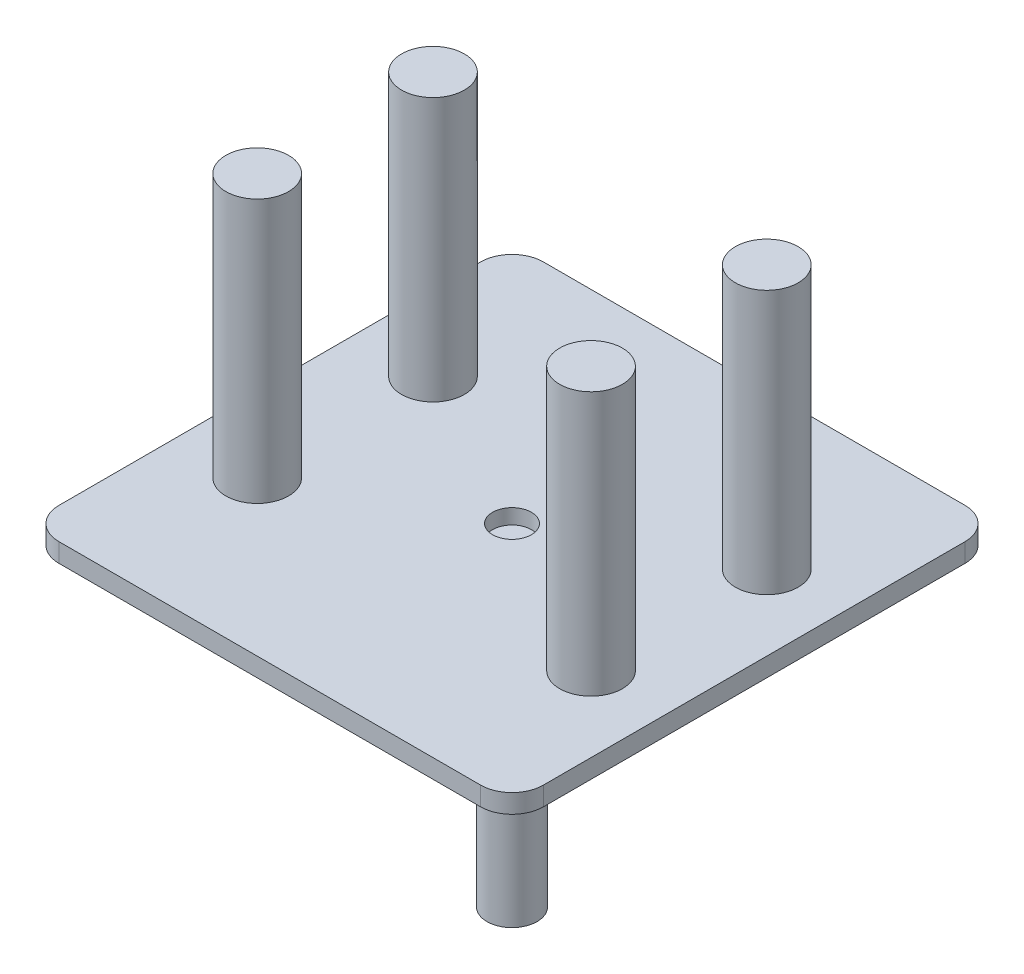
ISO-10303-21;
HEADER;
FILE_DESCRIPTION(('STEP AP214'),'2;1');
FILE_NAME('part.step','',(''),(''),'','','');
FILE_SCHEMA(('AUTOMOTIVE_DESIGN { 1 0 10303 214 1 1 1 1 }'));
ENDSEC;
DATA;
#1=APPLICATION_CONTEXT('core data for automotive mechanical design processes');
#2=APPLICATION_PROTOCOL_DEFINITION('international standard','automotive_design',2000,#1);
#3=PRODUCT_CONTEXT('',#1,'mechanical');
#4=PRODUCT('Part','Part','',(#3));
#5=PRODUCT_RELATED_PRODUCT_CATEGORY('part','',(#4));
#6=PRODUCT_DEFINITION_FORMATION('','',#4);
#7=PRODUCT_DEFINITION_CONTEXT('part definition',#1,'design');
#8=PRODUCT_DEFINITION('design','',#6,#7);
#9=PRODUCT_DEFINITION_SHAPE('','',#8);
#10=(LENGTH_UNIT() NAMED_UNIT(*) SI_UNIT(.MILLI.,.METRE.));
#11=(NAMED_UNIT(*) PLANE_ANGLE_UNIT() SI_UNIT($,.RADIAN.));
#12=(NAMED_UNIT(*) SI_UNIT($,.STERADIAN.) SOLID_ANGLE_UNIT());
#13=UNCERTAINTY_MEASURE_WITH_UNIT(LENGTH_MEASURE(1.E-05),#10,'distance_accuracy_value','');
#14=(GEOMETRIC_REPRESENTATION_CONTEXT(3) GLOBAL_UNCERTAINTY_ASSIGNED_CONTEXT((#13)) GLOBAL_UNIT_ASSIGNED_CONTEXT((#10,
#11,#12)) REPRESENTATION_CONTEXT('',''));
#15=CARTESIAN_POINT('',(0.,0.,0.));
#16=DIRECTION('',(0.,0.,1.));
#17=DIRECTION('',(1.,0.,0.));
#18=AXIS2_PLACEMENT_3D('',#15,#16,#17);
#19=CARTESIAN_POINT('',(16.795,1.5,-16.795));
#20=DIRECTION('',(0.,-1.,0.));
#21=DIRECTION('',(0.,0.,-1.));
#22=AXIS2_PLACEMENT_3D('',#19,#20,#21);
#23=CYLINDRICAL_SURFACE('',#22,2.5);
#24=CARTESIAN_POINT('',(16.795,0.,-16.795));
#25=DIRECTION('',(0.,1.,0.));
#26=DIRECTION('',(0.,0.,1.));
#27=AXIS2_PLACEMENT_3D('',#24,#25,#26);
#28=CIRCLE('',#27,2.5);
#29=CARTESIAN_POINT('',(19.295,0.,-16.795));
#30=VERTEX_POINT('',#29);
#31=CARTESIAN_POINT('',(16.795,0.,-19.295));
#32=VERTEX_POINT('',#31);
#33=EDGE_CURVE('E136',#30,#32,#28,.T.);
#34=ORIENTED_EDGE('',*,*,#33,.T.);
#35=DIRECTION('',(0.,-1.,0.));
#36=VECTOR('',#35,1.);
#37=CARTESIAN_POINT('',(16.795,1.5,-19.295));
#38=LINE('',#37,#36);
#39=CARTESIAN_POINT('',(16.795,1.5,-19.295));
#40=VERTEX_POINT('',#39);
#41=EDGE_CURVE('E38',#40,#32,#38,.T.);
#42=ORIENTED_EDGE('',*,*,#41,.F.);
#43=CARTESIAN_POINT('',(16.795,1.5,-16.795));
#44=DIRECTION('',(0.,1.,0.));
#45=DIRECTION('',(0.,0.,1.));
#46=AXIS2_PLACEMENT_3D('',#43,#44,#45);
#47=CIRCLE('',#46,2.5);
#48=CARTESIAN_POINT('',(19.295,1.5,-16.795));
#49=VERTEX_POINT('',#48);
#50=EDGE_CURVE('E154',#49,#40,#47,.T.);
#51=ORIENTED_EDGE('',*,*,#50,.F.);
#52=DIRECTION('',(0.,-1.,0.));
#53=VECTOR('',#52,1.);
#54=CARTESIAN_POINT('',(19.295,1.5,-16.795));
#55=LINE('',#54,#53);
#56=EDGE_CURVE('E135',#49,#30,#55,.T.);
#57=ORIENTED_EDGE('',*,*,#56,.T.);
#58=EDGE_LOOP('',(#34,#42,#51,#57));
#59=FACE_BOUND('',#58,.T.);
#60=ADVANCED_FACE('F35',(#59),#23,.T.);
#61=CARTESIAN_POINT('',(16.795,1.5,-19.295));
#62=DIRECTION('',(0.,0.,1.));
#63=DIRECTION('',(1.,0.,0.));
#64=AXIS2_PLACEMENT_3D('',#61,#62,#63);
#65=PLANE('',#64);
#66=DIRECTION('',(-1.,0.,0.));
#67=VECTOR('',#66,1.);
#68=CARTESIAN_POINT('',(16.795,0.,-19.295));
#69=LINE('',#68,#67);
#70=CARTESIAN_POINT('',(-16.795,0.,-19.295));
#71=VERTEX_POINT('',#70);
#72=EDGE_CURVE('E139',#32,#71,#69,.T.);
#73=ORIENTED_EDGE('',*,*,#72,.T.);
#74=DIRECTION('',(0.,-1.,0.));
#75=VECTOR('',#74,1.);
#76=CARTESIAN_POINT('',(-16.795,1.5,-19.295));
#77=LINE('',#76,#75);
#78=CARTESIAN_POINT('',(-16.795,1.5,-19.295));
#79=VERTEX_POINT('',#78);
#80=EDGE_CURVE('E161',#79,#71,#77,.T.);
#81=ORIENTED_EDGE('',*,*,#80,.F.);
#82=DIRECTION('',(-1.,0.,0.));
#83=VECTOR('',#82,1.);
#84=CARTESIAN_POINT('',(16.795,1.5,-19.295));
#85=LINE('',#84,#83);
#86=EDGE_CURVE('E96',#40,#79,#85,.T.);
#87=ORIENTED_EDGE('',*,*,#86,.F.);
#88=ORIENTED_EDGE('',*,*,#41,.T.);
#89=EDGE_LOOP('',(#73,#81,#87,#88));
#90=FACE_BOUND('',#89,.T.);
#91=ADVANCED_FACE('F213',(#90),#65,.F.);
#92=CARTESIAN_POINT('',(-16.795,1.5,-16.795));
#93=DIRECTION('',(0.,-1.,0.));
#94=DIRECTION('',(0.,0.,-1.));
#95=AXIS2_PLACEMENT_3D('',#92,#93,#94);
#96=CYLINDRICAL_SURFACE('',#95,2.5);
#97=CARTESIAN_POINT('',(-16.795,0.,-16.795));
#98=DIRECTION('',(0.,1.,0.));
#99=DIRECTION('',(0.,0.,1.));
#100=AXIS2_PLACEMENT_3D('',#97,#98,#99);
#101=CIRCLE('',#100,2.5);
#102=CARTESIAN_POINT('',(-19.295,0.,-16.795));
#103=VERTEX_POINT('',#102);
#104=EDGE_CURVE('E142',#71,#103,#101,.T.);
#105=ORIENTED_EDGE('',*,*,#104,.T.);
#106=DIRECTION('',(0.,-1.,0.));
#107=VECTOR('',#106,1.);
#108=CARTESIAN_POINT('',(-19.295,1.5,-16.795));
#109=LINE('',#108,#107);
#110=CARTESIAN_POINT('',(-19.295,1.5,-16.795));
#111=VERTEX_POINT('',#110);
#112=EDGE_CURVE('E160',#111,#103,#109,.T.);
#113=ORIENTED_EDGE('',*,*,#112,.F.);
#114=CARTESIAN_POINT('',(-16.795,1.5,-16.795));
#115=DIRECTION('',(0.,1.,0.));
#116=DIRECTION('',(0.,0.,1.));
#117=AXIS2_PLACEMENT_3D('',#114,#115,#116);
#118=CIRCLE('',#117,2.5);
#119=EDGE_CURVE('E187',#79,#111,#118,.T.);
#120=ORIENTED_EDGE('',*,*,#119,.F.);
#121=ORIENTED_EDGE('',*,*,#80,.T.);
#122=EDGE_LOOP('',(#105,#113,#120,#121));
#123=FACE_BOUND('',#122,.T.);
#124=ADVANCED_FACE('F217',(#123),#96,.T.);
#125=CARTESIAN_POINT('',(-19.295,1.5,16.795));
#126=DIRECTION('',(-1.,0.,0.));
#127=DIRECTION('',(0.,0.,1.));
#128=AXIS2_PLACEMENT_3D('',#125,#126,#127);
#129=PLANE('',#128);
#130=DIRECTION('',(0.,0.,-1.));
#131=VECTOR('',#130,1.);
#132=CARTESIAN_POINT('',(-19.295,0.,16.795));
#133=LINE('',#132,#131);
#134=CARTESIAN_POINT('',(-19.295,0.,16.795));
#135=VERTEX_POINT('',#134);
#136=EDGE_CURVE('E145',#135,#103,#133,.T.);
#137=ORIENTED_EDGE('',*,*,#136,.F.);
#138=DIRECTION('',(0.,-1.,0.));
#139=VECTOR('',#138,1.);
#140=CARTESIAN_POINT('',(-19.295,1.5,16.795));
#141=LINE('',#140,#139);
#142=CARTESIAN_POINT('',(-19.295,1.5,16.795));
#143=VERTEX_POINT('',#142);
#144=EDGE_CURVE('E158',#143,#135,#141,.T.);
#145=ORIENTED_EDGE('',*,*,#144,.F.);
#146=DIRECTION('',(0.,0.,-1.));
#147=VECTOR('',#146,1.);
#148=CARTESIAN_POINT('',(-19.295,1.5,16.795));
#149=LINE('',#148,#147);
#150=EDGE_CURVE('E130',#143,#111,#149,.T.);
#151=ORIENTED_EDGE('',*,*,#150,.T.);
#152=ORIENTED_EDGE('',*,*,#112,.T.);
#153=EDGE_LOOP('',(#137,#145,#151,#152));
#154=FACE_BOUND('',#153,.T.);
#155=ADVANCED_FACE('F191',(#154),#129,.T.);
#156=CARTESIAN_POINT('',(-16.795,1.5,16.795));
#157=DIRECTION('',(0.,-1.,0.));
#158=DIRECTION('',(0.,0.,-1.));
#159=AXIS2_PLACEMENT_3D('',#156,#157,#158);
#160=CYLINDRICAL_SURFACE('',#159,2.5);
#161=CARTESIAN_POINT('',(-16.795,0.,16.795));
#162=DIRECTION('',(0.,-1.,0.));
#163=DIRECTION('',(0.,0.,-1.));
#164=AXIS2_PLACEMENT_3D('',#161,#162,#163);
#165=CIRCLE('',#164,2.5);
#166=CARTESIAN_POINT('',(-16.795,0.,19.295));
#167=VERTEX_POINT('',#166);
#168=EDGE_CURVE('E148',#167,#135,#165,.T.);
#169=ORIENTED_EDGE('',*,*,#168,.F.);
#170=DIRECTION('',(0.,-1.,0.));
#171=VECTOR('',#170,1.);
#172=CARTESIAN_POINT('',(-16.795,1.5,19.295));
#173=LINE('',#172,#171);
#174=CARTESIAN_POINT('',(-16.795,1.5,19.295));
#175=VERTEX_POINT('',#174);
#176=EDGE_CURVE('E118',#175,#167,#173,.T.);
#177=ORIENTED_EDGE('',*,*,#176,.F.);
#178=CARTESIAN_POINT('',(-16.795,1.5,16.795));
#179=DIRECTION('',(0.,-1.,0.));
#180=DIRECTION('',(0.,0.,-1.));
#181=AXIS2_PLACEMENT_3D('',#178,#179,#180);
#182=CIRCLE('',#181,2.5);
#183=EDGE_CURVE('E128',#175,#143,#182,.T.);
#184=ORIENTED_EDGE('',*,*,#183,.T.);
#185=ORIENTED_EDGE('',*,*,#144,.T.);
#186=EDGE_LOOP('',(#169,#177,#184,#185));
#187=FACE_BOUND('',#186,.T.);
#188=ADVANCED_FACE('F195',(#187),#160,.T.);
#189=CARTESIAN_POINT('',(16.795,1.5,19.295));
#190=DIRECTION('',(0.,0.,1.));
#191=DIRECTION('',(1.,0.,0.));
#192=AXIS2_PLACEMENT_3D('',#189,#190,#191);
#193=PLANE('',#192);
#194=DIRECTION('',(-1.,0.,0.));
#195=VECTOR('',#194,1.);
#196=CARTESIAN_POINT('',(16.795,0.,19.295));
#197=LINE('',#196,#195);
#198=CARTESIAN_POINT('',(16.795,0.,19.295));
#199=VERTEX_POINT('',#198);
#200=EDGE_CURVE('E117',#199,#167,#197,.T.);
#201=ORIENTED_EDGE('',*,*,#200,.F.);
#202=DIRECTION('',(0.,-1.,0.));
#203=VECTOR('',#202,1.);
#204=CARTESIAN_POINT('',(16.795,1.5,19.295));
#205=LINE('',#204,#203);
#206=CARTESIAN_POINT('',(16.795,1.5,19.295));
#207=VERTEX_POINT('',#206);
#208=EDGE_CURVE('E111',#207,#199,#205,.T.);
#209=ORIENTED_EDGE('',*,*,#208,.F.);
#210=DIRECTION('',(-1.,0.,0.));
#211=VECTOR('',#210,1.);
#212=CARTESIAN_POINT('',(16.795,1.5,19.295));
#213=LINE('',#212,#211);
#214=EDGE_CURVE('E115',#207,#175,#213,.T.);
#215=ORIENTED_EDGE('',*,*,#214,.T.);
#216=ORIENTED_EDGE('',*,*,#176,.T.);
#217=EDGE_LOOP('',(#201,#209,#215,#216));
#218=FACE_BOUND('',#217,.T.);
#219=ADVANCED_FACE('F113',(#218),#193,.T.);
#220=CARTESIAN_POINT('',(16.795,1.5,16.795));
#221=DIRECTION('',(0.,-1.,0.));
#222=DIRECTION('',(0.,0.,-1.));
#223=AXIS2_PLACEMENT_3D('',#220,#221,#222);
#224=CYLINDRICAL_SURFACE('',#223,2.5);
#225=CARTESIAN_POINT('',(16.795,0.,16.795));
#226=DIRECTION('',(0.,1.,0.));
#227=DIRECTION('',(0.,0.,1.));
#228=AXIS2_PLACEMENT_3D('',#225,#226,#227);
#229=CIRCLE('',#228,2.5);
#230=CARTESIAN_POINT('',(19.295,0.,16.795));
#231=VERTEX_POINT('',#230);
#232=EDGE_CURVE('E81',#199,#231,#229,.T.);
#233=ORIENTED_EDGE('',*,*,#232,.T.);
#234=DIRECTION('',(0.,-1.,0.));
#235=VECTOR('',#234,1.);
#236=CARTESIAN_POINT('',(19.295,1.5,16.795));
#237=LINE('',#236,#235);
#238=CARTESIAN_POINT('',(19.295,1.5,16.795));
#239=VERTEX_POINT('',#238);
#240=EDGE_CURVE('E119',#239,#231,#237,.T.);
#241=ORIENTED_EDGE('',*,*,#240,.F.);
#242=CARTESIAN_POINT('',(16.795,1.5,16.795));
#243=DIRECTION('',(0.,1.,0.));
#244=DIRECTION('',(0.,0.,1.));
#245=AXIS2_PLACEMENT_3D('',#242,#243,#244);
#246=CIRCLE('',#245,2.5);
#247=EDGE_CURVE('E121',#207,#239,#246,.T.);
#248=ORIENTED_EDGE('',*,*,#247,.F.);
#249=ORIENTED_EDGE('',*,*,#208,.T.);
#250=EDGE_LOOP('',(#233,#241,#248,#249));
#251=FACE_BOUND('',#250,.T.);
#252=ADVANCED_FACE('F122',(#251),#224,.T.);
#253=CARTESIAN_POINT('',(19.295,1.5,16.795));
#254=DIRECTION('',(-1.,0.,0.));
#255=DIRECTION('',(0.,0.,1.));
#256=AXIS2_PLACEMENT_3D('',#253,#254,#255);
#257=PLANE('',#256);
#258=DIRECTION('',(0.,0.,-1.));
#259=VECTOR('',#258,1.);
#260=CARTESIAN_POINT('',(19.295,0.,16.795));
#261=LINE('',#260,#259);
#262=EDGE_CURVE('E87',#231,#30,#261,.T.);
#263=ORIENTED_EDGE('',*,*,#262,.T.);
#264=ORIENTED_EDGE('',*,*,#56,.F.);
#265=DIRECTION('',(0.,0.,-1.));
#266=VECTOR('',#265,1.);
#267=CARTESIAN_POINT('',(19.295,1.5,16.795));
#268=LINE('',#267,#266);
#269=EDGE_CURVE('E53',#239,#49,#268,.T.);
#270=ORIENTED_EDGE('',*,*,#269,.F.);
#271=ORIENTED_EDGE('',*,*,#240,.T.);
#272=EDGE_LOOP('',(#263,#264,#270,#271));
#273=FACE_BOUND('',#272,.T.);
#274=ADVANCED_FACE('F201',(#273),#257,.F.);
#275=CARTESIAN_POINT('',(16.795,1.5,-16.795));
#276=DIRECTION('',(0.,1.,0.));
#277=DIRECTION('',(0.,0.,1.));
#278=AXIS2_PLACEMENT_3D('',#275,#276,#277);
#279=PLANE('',#278);
#280=CARTESIAN_POINT('',(0.,1.5,0.));
#281=DIRECTION('',(0.,-1.,0.));
#282=DIRECTION('',(0.,0.,-1.));
#283=AXIS2_PLACEMENT_3D('',#280,#281,#282);
#284=CIRCLE('',#283,1.55);
#285=CARTESIAN_POINT('',(0.,1.5,-1.55));
#286=VERTEX_POINT('',#285);
#287=EDGE_CURVE('E460',#286,#286,#284,.T.);
#288=ORIENTED_EDGE('',*,*,#287,.T.);
#289=EDGE_LOOP('',(#288));
#290=FACE_BOUND('',#289,.T.);
#291=CARTESIAN_POINT('',(-13.295,1.5,-7.));
#292=DIRECTION('',(0.,1.,0.));
#293=DIRECTION('',(0.,0.,1.));
#294=AXIS2_PLACEMENT_3D('',#291,#292,#293);
#295=CIRCLE('',#294,2.5);
#296=CARTESIAN_POINT('',(-13.295,1.5,-9.5));
#297=VERTEX_POINT('',#296);
#298=EDGE_CURVE('E11',#297,#297,#295,.T.);
#299=ORIENTED_EDGE('',*,*,#298,.F.);
#300=EDGE_LOOP('',(#299));
#301=FACE_BOUND('',#300,.T.);
#302=CARTESIAN_POINT('',(13.295,1.5,6.99999999999999));
#303=DIRECTION('',(0.,1.,0.));
#304=DIRECTION('',(0.,0.,1.));
#305=AXIS2_PLACEMENT_3D('',#302,#303,#304);
#306=CIRCLE('',#305,2.5);
#307=CARTESIAN_POINT('',(13.295,1.5,4.49999999999999));
#308=VERTEX_POINT('',#307);
#309=EDGE_CURVE('E44',#308,#308,#306,.T.);
#310=ORIENTED_EDGE('',*,*,#309,.F.);
#311=EDGE_LOOP('',(#310));
#312=FACE_BOUND('',#311,.T.);
#313=CARTESIAN_POINT('',(13.295,1.5,-7.));
#314=DIRECTION('',(0.,1.,0.));
#315=DIRECTION('',(0.,0.,1.));
#316=AXIS2_PLACEMENT_3D('',#313,#314,#315);
#317=CIRCLE('',#316,2.5);
#318=CARTESIAN_POINT('',(13.295,1.5,-9.5));
#319=VERTEX_POINT('',#318);
#320=EDGE_CURVE('E177',#319,#319,#317,.F.);
#321=ORIENTED_EDGE('',*,*,#320,.T.);
#322=EDGE_LOOP('',(#321));
#323=FACE_BOUND('',#322,.T.);
#324=CARTESIAN_POINT('',(-13.295,1.5,6.99999999999999));
#325=DIRECTION('',(0.,1.,0.));
#326=DIRECTION('',(0.,0.,1.));
#327=AXIS2_PLACEMENT_3D('',#324,#325,#326);
#328=CIRCLE('',#327,2.5);
#329=CARTESIAN_POINT('',(-13.295,1.5,4.49999999999999));
#330=VERTEX_POINT('',#329);
#331=EDGE_CURVE('E140',#330,#330,#328,.F.);
#332=ORIENTED_EDGE('',*,*,#331,.T.);
#333=EDGE_LOOP('',(#332));
#334=FACE_BOUND('',#333,.T.);
#335=ORIENTED_EDGE('',*,*,#50,.T.);
#336=ORIENTED_EDGE('',*,*,#86,.T.);
#337=ORIENTED_EDGE('',*,*,#119,.T.);
#338=ORIENTED_EDGE('',*,*,#150,.F.);
#339=ORIENTED_EDGE('',*,*,#183,.F.);
#340=ORIENTED_EDGE('',*,*,#214,.F.);
#341=ORIENTED_EDGE('',*,*,#247,.T.);
#342=ORIENTED_EDGE('',*,*,#269,.T.);
#343=EDGE_LOOP('',(#335,#336,#337,#338,#339,#340,#341,#342));
#344=FACE_BOUND('',#343,.T.);
#345=ADVANCED_FACE('F125',(#290,#301,#312,#323,#334,#344),#279,.T.);
#346=CARTESIAN_POINT('',(16.795,0.,-16.795));
#347=DIRECTION('',(0.,1.,0.));
#348=DIRECTION('',(0.,0.,1.));
#349=AXIS2_PLACEMENT_3D('',#346,#347,#348);
#350=PLANE('',#349);
#351=CARTESIAN_POINT('',(-13.9653589284347,0.,-13.9653589284339));
#352=DIRECTION('',(0.,1.,0.));
#353=DIRECTION('',(0.,0.,1.));
#354=AXIS2_PLACEMENT_3D('',#351,#352,#353);
#355=CIRCLE('',#354,2.00000000000098);
#356=CARTESIAN_POINT('',(-13.9653589284347,0.,-11.9653589284329));
#357=VERTEX_POINT('',#356);
#358=EDGE_CURVE('E450',#357,#357,#355,.T.);
#359=ORIENTED_EDGE('',*,*,#358,.T.);
#360=EDGE_LOOP('',(#359));
#361=FACE_BOUND('',#360,.T.);
#362=CARTESIAN_POINT('',(13.9653589284347,0.,13.9653589284339));
#363=DIRECTION('',(0.,1.,0.));
#364=DIRECTION('',(0.,0.,1.));
#365=AXIS2_PLACEMENT_3D('',#362,#363,#364);
#366=CIRCLE('',#365,1.99999999999977);
#367=CARTESIAN_POINT('',(13.9653589284347,0.,15.9653589284337));
#368=VERTEX_POINT('',#367);
#369=EDGE_CURVE('E453',#368,#368,#366,.T.);
#370=ORIENTED_EDGE('',*,*,#369,.T.);
#371=EDGE_LOOP('',(#370));
#372=FACE_BOUND('',#371,.T.);
#373=ORIENTED_EDGE('',*,*,#33,.F.);
#374=ORIENTED_EDGE('',*,*,#262,.F.);
#375=ORIENTED_EDGE('',*,*,#232,.F.);
#376=ORIENTED_EDGE('',*,*,#200,.T.);
#377=ORIENTED_EDGE('',*,*,#168,.T.);
#378=ORIENTED_EDGE('',*,*,#136,.T.);
#379=ORIENTED_EDGE('',*,*,#104,.F.);
#380=ORIENTED_EDGE('',*,*,#72,.F.);
#381=EDGE_LOOP('',(#373,#374,#375,#376,#377,#378,#379,#380));
#382=FACE_BOUND('',#381,.T.);
#383=ADVANCED_FACE('F198',(#361,#372,#382),#350,.F.);
#384=CARTESIAN_POINT('',(-13.295,22.5,6.99999999999999));
#385=DIRECTION('',(0.,-1.,0.));
#386=DIRECTION('',(0.,0.,-1.));
#387=AXIS2_PLACEMENT_3D('',#384,#385,#386);
#388=CYLINDRICAL_SURFACE('',#387,2.5);
#389=CARTESIAN_POINT('',(-13.295,22.5,6.99999999999999));
#390=DIRECTION('',(0.,1.,0.));
#391=DIRECTION('',(0.,0.,1.));
#392=AXIS2_PLACEMENT_3D('',#389,#390,#391);
#393=CIRCLE('',#392,2.5);
#394=CARTESIAN_POINT('',(-13.295,22.5,4.49999999999999));
#395=VERTEX_POINT('',#394);
#396=EDGE_CURVE('E180',#395,#395,#393,.T.);
#397=CARTESIAN_POINT('',(-13.295,1.5,4.49999999999999));
#398=CARTESIAN_POINT('',(-13.295,1.71875,4.49999999999999));
#399=CARTESIAN_POINT('',(-13.295,1.9375,4.49999999999999));
#400=CARTESIAN_POINT('',(-13.295,2.375,4.49999999999999));
#401=CARTESIAN_POINT('',(-13.295,2.59375,4.49999999999999));
#402=CARTESIAN_POINT('',(-13.295,3.03125,4.49999999999999));
#403=CARTESIAN_POINT('',(-13.295,3.25,4.49999999999999));
#404=CARTESIAN_POINT('',(-13.295,3.6875,4.49999999999999));
#405=CARTESIAN_POINT('',(-13.295,3.90625,4.49999999999999));
#406=CARTESIAN_POINT('',(-13.295,4.34375,4.49999999999999));
#407=CARTESIAN_POINT('',(-13.295,4.5625,4.49999999999999));
#408=CARTESIAN_POINT('',(-13.295,5.,4.49999999999999));
#409=CARTESIAN_POINT('',(-13.295,5.21875,4.49999999999999));
#410=CARTESIAN_POINT('',(-13.295,5.65625,4.49999999999999));
#411=CARTESIAN_POINT('',(-13.295,5.875,4.49999999999999));
#412=CARTESIAN_POINT('',(-13.295,6.3125,4.49999999999999));
#413=CARTESIAN_POINT('',(-13.295,6.53125,4.49999999999999));
#414=CARTESIAN_POINT('',(-13.295,6.96875,4.49999999999999));
#415=CARTESIAN_POINT('',(-13.295,7.1875,4.49999999999999));
#416=CARTESIAN_POINT('',(-13.295,7.625,4.49999999999999));
#417=CARTESIAN_POINT('',(-13.295,7.84375,4.49999999999999));
#418=CARTESIAN_POINT('',(-13.295,8.28125,4.49999999999999));
#419=CARTESIAN_POINT('',(-13.295,8.5,4.49999999999999));
#420=CARTESIAN_POINT('',(-13.295,8.9375,4.49999999999999));
#421=CARTESIAN_POINT('',(-13.295,9.15625,4.49999999999999));
#422=CARTESIAN_POINT('',(-13.295,9.59375,4.49999999999999));
#423=CARTESIAN_POINT('',(-13.295,9.8125,4.49999999999999));
#424=CARTESIAN_POINT('',(-13.295,10.25,4.49999999999999));
#425=CARTESIAN_POINT('',(-13.295,10.46875,4.49999999999999));
#426=CARTESIAN_POINT('',(-13.295,10.90625,4.49999999999999));
#427=CARTESIAN_POINT('',(-13.295,11.125,4.49999999999999));
#428=CARTESIAN_POINT('',(-13.295,11.5625,4.49999999999999));
#429=CARTESIAN_POINT('',(-13.295,11.78125,4.49999999999999));
#430=CARTESIAN_POINT('',(-13.295,12.21875,4.49999999999999));
#431=CARTESIAN_POINT('',(-13.295,12.4375,4.49999999999999));
#432=CARTESIAN_POINT('',(-13.295,12.875,4.49999999999999));
#433=CARTESIAN_POINT('',(-13.295,13.09375,4.49999999999999));
#434=CARTESIAN_POINT('',(-13.295,13.53125,4.49999999999999));
#435=CARTESIAN_POINT('',(-13.295,13.75,4.49999999999999));
#436=CARTESIAN_POINT('',(-13.295,14.1875,4.49999999999999));
#437=CARTESIAN_POINT('',(-13.295,14.40625,4.49999999999999));
#438=CARTESIAN_POINT('',(-13.295,14.84375,4.49999999999999));
#439=CARTESIAN_POINT('',(-13.295,15.0625,4.49999999999999));
#440=CARTESIAN_POINT('',(-13.295,15.5,4.49999999999999));
#441=CARTESIAN_POINT('',(-13.295,15.71875,4.49999999999999));
#442=CARTESIAN_POINT('',(-13.295,16.15625,4.49999999999999));
#443=CARTESIAN_POINT('',(-13.295,16.375,4.49999999999999));
#444=CARTESIAN_POINT('',(-13.295,16.8125,4.49999999999999));
#445=CARTESIAN_POINT('',(-13.295,17.03125,4.49999999999999));
#446=CARTESIAN_POINT('',(-13.295,17.46875,4.49999999999999));
#447=CARTESIAN_POINT('',(-13.295,17.6875,4.49999999999999));
#448=CARTESIAN_POINT('',(-13.295,18.125,4.49999999999999));
#449=CARTESIAN_POINT('',(-13.295,18.34375,4.49999999999999));
#450=CARTESIAN_POINT('',(-13.295,18.78125,4.49999999999999));
#451=CARTESIAN_POINT('',(-13.295,19.,4.49999999999999));
#452=CARTESIAN_POINT('',(-13.295,19.4375,4.49999999999999));
#453=CARTESIAN_POINT('',(-13.295,19.65625,4.49999999999999));
#454=CARTESIAN_POINT('',(-13.295,20.09375,4.49999999999999));
#455=CARTESIAN_POINT('',(-13.295,20.3125,4.49999999999999));
#456=CARTESIAN_POINT('',(-13.295,20.75,4.49999999999999));
#457=CARTESIAN_POINT('',(-13.295,20.96875,4.49999999999999));
#458=CARTESIAN_POINT('',(-13.295,21.40625,4.49999999999999));
#459=CARTESIAN_POINT('',(-13.295,21.625,4.49999999999999));
#460=CARTESIAN_POINT('',(-13.295,22.0625,4.49999999999999));
#461=CARTESIAN_POINT('',(-13.295,22.28125,4.49999999999999));
#462=CARTESIAN_POINT('',(-13.295,22.5,4.49999999999999));
#463=B_SPLINE_CURVE_WITH_KNOTS('',3,(#397,#398,#399,#400,#401,#402,#403,#404,#405,#406,#407,
#408,#409,#410,#411,#412,#413,#414,#415,#416,#417,#418,#419,#420,#421,#422,#423,#424,#425,#426,
#427,#428,#429,#430,#431,#432,#433,#434,#435,#436,#437,#438,#439,#440,#441,#442,#443,#444,#445,
#446,#447,#448,#449,#450,#451,#452,#453,#454,#455,#456,#457,#458,#459,#460,#461,#462),
.UNSPECIFIED.,.F.,.F.,(4,2,2,2,2,2,2,2,2,2,2,2,2,2,2,2,2,2,2,2,2,2,2,2,2,2,2,2,2,2,2,2,4),(0.,
0.656250000000001,1.3125,1.96875,2.625,3.28125,3.9375,4.59375,5.25,5.90625,6.5625,7.21875,7.875,
8.53125,9.1875,9.84375,10.5,11.15625,11.8125,12.46875,13.125,13.78125,14.4375,15.09375,15.75,
16.40625,17.0625,17.71875,18.375,19.03125,19.6875,20.34375,21.),.UNSPECIFIED.);
#464=EDGE_CURVE('BSEAM246',#330,#395,#463,.T.);
#465=ORIENTED_EDGE('',*,*,#331,.F.);
#466=ORIENTED_EDGE('',*,*,#396,.F.);
#467=ORIENTED_EDGE('',*,*,#464,.T.);
#468=ORIENTED_EDGE('',*,*,#464,.F.);
#469=EDGE_LOOP('',(#465,#467,#466,#468));
#470=FACE_BOUND('',#469,.T.);
#471=ADVANCED_FACE('F246',(#470),#388,.T.);
#472=CARTESIAN_POINT('',(0.,22.5,0.));
#473=DIRECTION('',(0.,1.,0.));
#474=DIRECTION('',(0.,0.,1.));
#475=AXIS2_PLACEMENT_3D('',#472,#473,#474);
#476=PLANE('',#475);
#477=ORIENTED_EDGE('',*,*,#396,.T.);
#478=EDGE_LOOP('',(#477));
#479=FACE_BOUND('',#478,.T.);
#480=ADVANCED_FACE('F251',(#479),#476,.T.);
#481=CARTESIAN_POINT('',(13.295,22.5,-7.));
#482=DIRECTION('',(0.,-1.,0.));
#483=DIRECTION('',(0.,0.,-1.));
#484=AXIS2_PLACEMENT_3D('',#481,#482,#483);
#485=CYLINDRICAL_SURFACE('',#484,2.5);
#486=CARTESIAN_POINT('',(13.295,22.5,-7.));
#487=DIRECTION('',(0.,1.,0.));
#488=DIRECTION('',(0.,0.,1.));
#489=AXIS2_PLACEMENT_3D('',#486,#487,#488);
#490=CIRCLE('',#489,2.5);
#491=CARTESIAN_POINT('',(13.295,22.5,-9.5));
#492=VERTEX_POINT('',#491);
#493=EDGE_CURVE('E174',#492,#492,#490,.T.);
#494=CARTESIAN_POINT('',(13.295,1.5,-9.5));
#495=CARTESIAN_POINT('',(13.295,1.71875,-9.5));
#496=CARTESIAN_POINT('',(13.295,1.9375,-9.5));
#497=CARTESIAN_POINT('',(13.295,2.375,-9.5));
#498=CARTESIAN_POINT('',(13.295,2.59375,-9.5));
#499=CARTESIAN_POINT('',(13.295,3.03125,-9.5));
#500=CARTESIAN_POINT('',(13.295,3.25,-9.5));
#501=CARTESIAN_POINT('',(13.295,3.6875,-9.5));
#502=CARTESIAN_POINT('',(13.295,3.90625,-9.5));
#503=CARTESIAN_POINT('',(13.295,4.34375,-9.5));
#504=CARTESIAN_POINT('',(13.295,4.5625,-9.5));
#505=CARTESIAN_POINT('',(13.295,5.,-9.5));
#506=CARTESIAN_POINT('',(13.295,5.21875,-9.5));
#507=CARTESIAN_POINT('',(13.295,5.65625,-9.5));
#508=CARTESIAN_POINT('',(13.295,5.875,-9.5));
#509=CARTESIAN_POINT('',(13.295,6.3125,-9.5));
#510=CARTESIAN_POINT('',(13.295,6.53125,-9.5));
#511=CARTESIAN_POINT('',(13.295,6.96875,-9.5));
#512=CARTESIAN_POINT('',(13.295,7.1875,-9.5));
#513=CARTESIAN_POINT('',(13.295,7.625,-9.5));
#514=CARTESIAN_POINT('',(13.295,7.84375,-9.5));
#515=CARTESIAN_POINT('',(13.295,8.28125,-9.5));
#516=CARTESIAN_POINT('',(13.295,8.5,-9.5));
#517=CARTESIAN_POINT('',(13.295,8.9375,-9.5));
#518=CARTESIAN_POINT('',(13.295,9.15625,-9.5));
#519=CARTESIAN_POINT('',(13.295,9.59375,-9.5));
#520=CARTESIAN_POINT('',(13.295,9.8125,-9.5));
#521=CARTESIAN_POINT('',(13.295,10.25,-9.5));
#522=CARTESIAN_POINT('',(13.295,10.46875,-9.5));
#523=CARTESIAN_POINT('',(13.295,10.90625,-9.5));
#524=CARTESIAN_POINT('',(13.295,11.125,-9.5));
#525=CARTESIAN_POINT('',(13.295,11.5625,-9.5));
#526=CARTESIAN_POINT('',(13.295,11.78125,-9.5));
#527=CARTESIAN_POINT('',(13.295,12.21875,-9.5));
#528=CARTESIAN_POINT('',(13.295,12.4375,-9.5));
#529=CARTESIAN_POINT('',(13.295,12.875,-9.5));
#530=CARTESIAN_POINT('',(13.295,13.09375,-9.5));
#531=CARTESIAN_POINT('',(13.295,13.53125,-9.5));
#532=CARTESIAN_POINT('',(13.295,13.75,-9.5));
#533=CARTESIAN_POINT('',(13.295,14.1875,-9.5));
#534=CARTESIAN_POINT('',(13.295,14.40625,-9.5));
#535=CARTESIAN_POINT('',(13.295,14.84375,-9.5));
#536=CARTESIAN_POINT('',(13.295,15.0625,-9.5));
#537=CARTESIAN_POINT('',(13.295,15.5,-9.5));
#538=CARTESIAN_POINT('',(13.295,15.71875,-9.5));
#539=CARTESIAN_POINT('',(13.295,16.15625,-9.5));
#540=CARTESIAN_POINT('',(13.295,16.375,-9.5));
#541=CARTESIAN_POINT('',(13.295,16.8125,-9.5));
#542=CARTESIAN_POINT('',(13.295,17.03125,-9.5));
#543=CARTESIAN_POINT('',(13.295,17.46875,-9.5));
#544=CARTESIAN_POINT('',(13.295,17.6875,-9.5));
#545=CARTESIAN_POINT('',(13.295,18.125,-9.5));
#546=CARTESIAN_POINT('',(13.295,18.34375,-9.5));
#547=CARTESIAN_POINT('',(13.295,18.78125,-9.5));
#548=CARTESIAN_POINT('',(13.295,19.,-9.5));
#549=CARTESIAN_POINT('',(13.295,19.4375,-9.5));
#550=CARTESIAN_POINT('',(13.295,19.65625,-9.5));
#551=CARTESIAN_POINT('',(13.295,20.09375,-9.5));
#552=CARTESIAN_POINT('',(13.295,20.3125,-9.5));
#553=CARTESIAN_POINT('',(13.295,20.75,-9.5));
#554=CARTESIAN_POINT('',(13.295,20.96875,-9.5));
#555=CARTESIAN_POINT('',(13.295,21.40625,-9.5));
#556=CARTESIAN_POINT('',(13.295,21.625,-9.5));
#557=CARTESIAN_POINT('',(13.295,22.0625,-9.5));
#558=CARTESIAN_POINT('',(13.295,22.28125,-9.5));
#559=CARTESIAN_POINT('',(13.295,22.5,-9.5));
#560=B_SPLINE_CURVE_WITH_KNOTS('',3,(#494,#495,#496,#497,#498,#499,#500,#501,#502,#503,#504,
#505,#506,#507,#508,#509,#510,#511,#512,#513,#514,#515,#516,#517,#518,#519,#520,#521,#522,#523,
#524,#525,#526,#527,#528,#529,#530,#531,#532,#533,#534,#535,#536,#537,#538,#539,#540,#541,#542,
#543,#544,#545,#546,#547,#548,#549,#550,#551,#552,#553,#554,#555,#556,#557,#558,#559),
.UNSPECIFIED.,.F.,.F.,(4,2,2,2,2,2,2,2,2,2,2,2,2,2,2,2,2,2,2,2,2,2,2,2,2,2,2,2,2,2,2,2,4),(0.,
0.656250000000001,1.3125,1.96875,2.625,3.28125,3.9375,4.59375,5.25,5.90625,6.5625,7.21875,7.875,
8.53125,9.1875,9.84375,10.5,11.15625,11.8125,12.46875,13.125,13.78125,14.4375,15.09375,15.75,
16.40625,17.0625,17.71875,18.375,19.03125,19.6875,20.34375,21.),.UNSPECIFIED.);
#561=EDGE_CURVE('BSEAM263',#319,#492,#560,.T.);
#562=ORIENTED_EDGE('',*,*,#320,.F.);
#563=ORIENTED_EDGE('',*,*,#493,.F.);
#564=ORIENTED_EDGE('',*,*,#561,.T.);
#565=ORIENTED_EDGE('',*,*,#561,.F.);
#566=EDGE_LOOP('',(#562,#564,#563,#565));
#567=FACE_BOUND('',#566,.T.);
#568=ADVANCED_FACE('F263',(#567),#485,.T.);
#569=CARTESIAN_POINT('',(13.295,22.5,-7.));
#570=DIRECTION('',(0.,1.,0.));
#571=DIRECTION('',(0.,0.,1.));
#572=AXIS2_PLACEMENT_3D('',#569,#570,#571);
#573=PLANE('',#572);
#574=ORIENTED_EDGE('',*,*,#493,.T.);
#575=EDGE_LOOP('',(#574));
#576=FACE_BOUND('',#575,.T.);
#577=ADVANCED_FACE('F273',(#576),#573,.T.);
#578=CARTESIAN_POINT('',(13.295,22.5,6.99999999999999));
#579=DIRECTION('',(0.,-1.,0.));
#580=DIRECTION('',(0.,0.,-1.));
#581=AXIS2_PLACEMENT_3D('',#578,#579,#580);
#582=CYLINDRICAL_SURFACE('',#581,2.5);
#583=CARTESIAN_POINT('',(13.295,22.5,6.99999999999999));
#584=DIRECTION('',(0.,-1.,0.));
#585=DIRECTION('',(0.,0.,-1.));
#586=AXIS2_PLACEMENT_3D('',#583,#584,#585);
#587=CIRCLE('',#586,2.5);
#588=CARTESIAN_POINT('',(13.295,22.5,4.49999999999999));
#589=VERTEX_POINT('',#588);
#590=EDGE_CURVE('E173',#589,#589,#587,.T.);
#591=CARTESIAN_POINT('',(13.295,1.5,4.49999999999999));
#592=CARTESIAN_POINT('',(13.295,1.71875,4.49999999999999));
#593=CARTESIAN_POINT('',(13.295,1.9375,4.49999999999999));
#594=CARTESIAN_POINT('',(13.295,2.375,4.49999999999999));
#595=CARTESIAN_POINT('',(13.295,2.59375,4.49999999999999));
#596=CARTESIAN_POINT('',(13.295,3.03125,4.49999999999999));
#597=CARTESIAN_POINT('',(13.295,3.25,4.49999999999999));
#598=CARTESIAN_POINT('',(13.295,3.6875,4.49999999999999));
#599=CARTESIAN_POINT('',(13.295,3.90625,4.49999999999999));
#600=CARTESIAN_POINT('',(13.295,4.34375,4.49999999999999));
#601=CARTESIAN_POINT('',(13.295,4.5625,4.49999999999999));
#602=CARTESIAN_POINT('',(13.295,5.,4.49999999999999));
#603=CARTESIAN_POINT('',(13.295,5.21875,4.49999999999999));
#604=CARTESIAN_POINT('',(13.295,5.65625,4.49999999999999));
#605=CARTESIAN_POINT('',(13.295,5.875,4.49999999999999));
#606=CARTESIAN_POINT('',(13.295,6.3125,4.49999999999999));
#607=CARTESIAN_POINT('',(13.295,6.53125,4.49999999999999));
#608=CARTESIAN_POINT('',(13.295,6.96875,4.49999999999999));
#609=CARTESIAN_POINT('',(13.295,7.1875,4.49999999999999));
#610=CARTESIAN_POINT('',(13.295,7.625,4.49999999999999));
#611=CARTESIAN_POINT('',(13.295,7.84375,4.49999999999999));
#612=CARTESIAN_POINT('',(13.295,8.28125,4.49999999999999));
#613=CARTESIAN_POINT('',(13.295,8.5,4.49999999999999));
#614=CARTESIAN_POINT('',(13.295,8.9375,4.49999999999999));
#615=CARTESIAN_POINT('',(13.295,9.15625,4.49999999999999));
#616=CARTESIAN_POINT('',(13.295,9.59375,4.49999999999999));
#617=CARTESIAN_POINT('',(13.295,9.8125,4.49999999999999));
#618=CARTESIAN_POINT('',(13.295,10.25,4.49999999999999));
#619=CARTESIAN_POINT('',(13.295,10.46875,4.49999999999999));
#620=CARTESIAN_POINT('',(13.295,10.90625,4.49999999999999));
#621=CARTESIAN_POINT('',(13.295,11.125,4.49999999999999));
#622=CARTESIAN_POINT('',(13.295,11.5625,4.49999999999999));
#623=CARTESIAN_POINT('',(13.295,11.78125,4.49999999999999));
#624=CARTESIAN_POINT('',(13.295,12.21875,4.49999999999999));
#625=CARTESIAN_POINT('',(13.295,12.4375,4.49999999999999));
#626=CARTESIAN_POINT('',(13.295,12.875,4.49999999999999));
#627=CARTESIAN_POINT('',(13.295,13.09375,4.49999999999999));
#628=CARTESIAN_POINT('',(13.295,13.53125,4.49999999999999));
#629=CARTESIAN_POINT('',(13.295,13.75,4.49999999999999));
#630=CARTESIAN_POINT('',(13.295,14.1875,4.49999999999999));
#631=CARTESIAN_POINT('',(13.295,14.40625,4.49999999999999));
#632=CARTESIAN_POINT('',(13.295,14.84375,4.49999999999999));
#633=CARTESIAN_POINT('',(13.295,15.0625,4.49999999999999));
#634=CARTESIAN_POINT('',(13.295,15.5,4.49999999999999));
#635=CARTESIAN_POINT('',(13.295,15.71875,4.49999999999999));
#636=CARTESIAN_POINT('',(13.295,16.15625,4.49999999999999));
#637=CARTESIAN_POINT('',(13.295,16.375,4.49999999999999));
#638=CARTESIAN_POINT('',(13.295,16.8125,4.49999999999999));
#639=CARTESIAN_POINT('',(13.295,17.03125,4.49999999999999));
#640=CARTESIAN_POINT('',(13.295,17.46875,4.49999999999999));
#641=CARTESIAN_POINT('',(13.295,17.6875,4.49999999999999));
#642=CARTESIAN_POINT('',(13.295,18.125,4.49999999999999));
#643=CARTESIAN_POINT('',(13.295,18.34375,4.49999999999999));
#644=CARTESIAN_POINT('',(13.295,18.78125,4.49999999999999));
#645=CARTESIAN_POINT('',(13.295,19.,4.49999999999999));
#646=CARTESIAN_POINT('',(13.295,19.4375,4.49999999999999));
#647=CARTESIAN_POINT('',(13.295,19.65625,4.49999999999999));
#648=CARTESIAN_POINT('',(13.295,20.09375,4.49999999999999));
#649=CARTESIAN_POINT('',(13.295,20.3125,4.49999999999999));
#650=CARTESIAN_POINT('',(13.295,20.75,4.49999999999999));
#651=CARTESIAN_POINT('',(13.295,20.96875,4.49999999999999));
#652=CARTESIAN_POINT('',(13.295,21.40625,4.49999999999999));
#653=CARTESIAN_POINT('',(13.295,21.625,4.49999999999999));
#654=CARTESIAN_POINT('',(13.295,22.0625,4.49999999999999));
#655=CARTESIAN_POINT('',(13.295,22.28125,4.49999999999999));
#656=CARTESIAN_POINT('',(13.295,22.5,4.49999999999999));
#657=B_SPLINE_CURVE_WITH_KNOTS('',3,(#591,#592,#593,#594,#595,#596,#597,#598,#599,#600,#601,
#602,#603,#604,#605,#606,#607,#608,#609,#610,#611,#612,#613,#614,#615,#616,#617,#618,#619,#620,
#621,#622,#623,#624,#625,#626,#627,#628,#629,#630,#631,#632,#633,#634,#635,#636,#637,#638,#639,
#640,#641,#642,#643,#644,#645,#646,#647,#648,#649,#650,#651,#652,#653,#654,#655,#656),
.UNSPECIFIED.,.F.,.F.,(4,2,2,2,2,2,2,2,2,2,2,2,2,2,2,2,2,2,2,2,2,2,2,2,2,2,2,2,2,2,2,2,4),(0.,
0.656250000000001,1.3125,1.96875,2.625,3.28125,3.9375,4.59375,5.25,5.90625,6.5625,7.21875,7.875,
8.53125,9.1875,9.84375,10.5,11.15625,11.8125,12.46875,13.125,13.78125,14.4375,15.09375,15.75,
16.40625,17.0625,17.71875,18.375,19.03125,19.6875,20.34375,21.),.UNSPECIFIED.);
#658=EDGE_CURVE('BSEAM283',#308,#589,#657,.T.);
#659=ORIENTED_EDGE('',*,*,#309,.T.);
#660=ORIENTED_EDGE('',*,*,#590,.T.);
#661=ORIENTED_EDGE('',*,*,#658,.T.);
#662=ORIENTED_EDGE('',*,*,#658,.F.);
#663=EDGE_LOOP('',(#659,#661,#660,#662));
#664=FACE_BOUND('',#663,.T.);
#665=ADVANCED_FACE('F283',(#664),#582,.T.);
#666=CARTESIAN_POINT('',(13.295,22.5,6.99999999999999));
#667=DIRECTION('',(0.,-1.,0.));
#668=DIRECTION('',(0.,0.,-1.));
#669=AXIS2_PLACEMENT_3D('',#666,#667,#668);
#670=PLANE('',#669);
#671=ORIENTED_EDGE('',*,*,#590,.F.);
#672=EDGE_LOOP('',(#671));
#673=FACE_BOUND('',#672,.T.);
#674=ADVANCED_FACE('F293',(#673),#670,.F.);
#675=CARTESIAN_POINT('',(-13.295,22.5,-7.));
#676=DIRECTION('',(0.,-1.,0.));
#677=DIRECTION('',(0.,0.,-1.));
#678=AXIS2_PLACEMENT_3D('',#675,#676,#677);
#679=CYLINDRICAL_SURFACE('',#678,2.5);
#680=CARTESIAN_POINT('',(-13.295,22.5,-7.));
#681=DIRECTION('',(0.,-1.,0.));
#682=DIRECTION('',(0.,0.,-1.));
#683=AXIS2_PLACEMENT_3D('',#680,#681,#682);
#684=CIRCLE('',#683,2.5);
#685=CARTESIAN_POINT('',(-13.295,22.5,-9.5));
#686=VERTEX_POINT('',#685);
#687=EDGE_CURVE('E466',#686,#686,#684,.T.);
#688=CARTESIAN_POINT('',(-13.295,1.5,-9.5));
#689=CARTESIAN_POINT('',(-13.295,1.71875,-9.5));
#690=CARTESIAN_POINT('',(-13.295,1.9375,-9.5));
#691=CARTESIAN_POINT('',(-13.295,2.375,-9.5));
#692=CARTESIAN_POINT('',(-13.295,2.59375,-9.5));
#693=CARTESIAN_POINT('',(-13.295,3.03125,-9.5));
#694=CARTESIAN_POINT('',(-13.295,3.25,-9.5));
#695=CARTESIAN_POINT('',(-13.295,3.6875,-9.5));
#696=CARTESIAN_POINT('',(-13.295,3.90625,-9.5));
#697=CARTESIAN_POINT('',(-13.295,4.34375,-9.5));
#698=CARTESIAN_POINT('',(-13.295,4.5625,-9.5));
#699=CARTESIAN_POINT('',(-13.295,5.,-9.5));
#700=CARTESIAN_POINT('',(-13.295,5.21875,-9.5));
#701=CARTESIAN_POINT('',(-13.295,5.65625,-9.5));
#702=CARTESIAN_POINT('',(-13.295,5.875,-9.5));
#703=CARTESIAN_POINT('',(-13.295,6.3125,-9.5));
#704=CARTESIAN_POINT('',(-13.295,6.53125,-9.5));
#705=CARTESIAN_POINT('',(-13.295,6.96875,-9.5));
#706=CARTESIAN_POINT('',(-13.295,7.1875,-9.5));
#707=CARTESIAN_POINT('',(-13.295,7.625,-9.5));
#708=CARTESIAN_POINT('',(-13.295,7.84375,-9.5));
#709=CARTESIAN_POINT('',(-13.295,8.28125,-9.5));
#710=CARTESIAN_POINT('',(-13.295,8.5,-9.5));
#711=CARTESIAN_POINT('',(-13.295,8.9375,-9.5));
#712=CARTESIAN_POINT('',(-13.295,9.15625,-9.5));
#713=CARTESIAN_POINT('',(-13.295,9.59375,-9.5));
#714=CARTESIAN_POINT('',(-13.295,9.8125,-9.5));
#715=CARTESIAN_POINT('',(-13.295,10.25,-9.5));
#716=CARTESIAN_POINT('',(-13.295,10.46875,-9.5));
#717=CARTESIAN_POINT('',(-13.295,10.90625,-9.5));
#718=CARTESIAN_POINT('',(-13.295,11.125,-9.5));
#719=CARTESIAN_POINT('',(-13.295,11.5625,-9.5));
#720=CARTESIAN_POINT('',(-13.295,11.78125,-9.5));
#721=CARTESIAN_POINT('',(-13.295,12.21875,-9.5));
#722=CARTESIAN_POINT('',(-13.295,12.4375,-9.5));
#723=CARTESIAN_POINT('',(-13.295,12.875,-9.5));
#724=CARTESIAN_POINT('',(-13.295,13.09375,-9.5));
#725=CARTESIAN_POINT('',(-13.295,13.53125,-9.5));
#726=CARTESIAN_POINT('',(-13.295,13.75,-9.5));
#727=CARTESIAN_POINT('',(-13.295,14.1875,-9.5));
#728=CARTESIAN_POINT('',(-13.295,14.40625,-9.5));
#729=CARTESIAN_POINT('',(-13.295,14.84375,-9.5));
#730=CARTESIAN_POINT('',(-13.295,15.0625,-9.5));
#731=CARTESIAN_POINT('',(-13.295,15.5,-9.5));
#732=CARTESIAN_POINT('',(-13.295,15.71875,-9.5));
#733=CARTESIAN_POINT('',(-13.295,16.15625,-9.5));
#734=CARTESIAN_POINT('',(-13.295,16.375,-9.5));
#735=CARTESIAN_POINT('',(-13.295,16.8125,-9.5));
#736=CARTESIAN_POINT('',(-13.295,17.03125,-9.5));
#737=CARTESIAN_POINT('',(-13.295,17.46875,-9.5));
#738=CARTESIAN_POINT('',(-13.295,17.6875,-9.5));
#739=CARTESIAN_POINT('',(-13.295,18.125,-9.5));
#740=CARTESIAN_POINT('',(-13.295,18.34375,-9.5));
#741=CARTESIAN_POINT('',(-13.295,18.78125,-9.5));
#742=CARTESIAN_POINT('',(-13.295,19.,-9.5));
#743=CARTESIAN_POINT('',(-13.295,19.4375,-9.5));
#744=CARTESIAN_POINT('',(-13.295,19.65625,-9.5));
#745=CARTESIAN_POINT('',(-13.295,20.09375,-9.5));
#746=CARTESIAN_POINT('',(-13.295,20.3125,-9.5));
#747=CARTESIAN_POINT('',(-13.295,20.75,-9.5));
#748=CARTESIAN_POINT('',(-13.295,20.96875,-9.5));
#749=CARTESIAN_POINT('',(-13.295,21.40625,-9.5));
#750=CARTESIAN_POINT('',(-13.295,21.625,-9.5));
#751=CARTESIAN_POINT('',(-13.295,22.0625,-9.5));
#752=CARTESIAN_POINT('',(-13.295,22.28125,-9.5));
#753=CARTESIAN_POINT('',(-13.295,22.5,-9.5));
#754=B_SPLINE_CURVE_WITH_KNOTS('',3,(#688,#689,#690,#691,#692,#693,#694,#695,#696,#697,#698,
#699,#700,#701,#702,#703,#704,#705,#706,#707,#708,#709,#710,#711,#712,#713,#714,#715,#716,#717,
#718,#719,#720,#721,#722,#723,#724,#725,#726,#727,#728,#729,#730,#731,#732,#733,#734,#735,#736,
#737,#738,#739,#740,#741,#742,#743,#744,#745,#746,#747,#748,#749,#750,#751,#752,#753),
.UNSPECIFIED.,.F.,.F.,(4,2,2,2,2,2,2,2,2,2,2,2,2,2,2,2,2,2,2,2,2,2,2,2,2,2,2,2,2,2,2,2,4),(0.,
0.656250000000001,1.3125,1.96875,2.625,3.28125,3.9375,4.59375,5.25,5.90625,6.5625,7.21875,7.875,
8.53125,9.1875,9.84375,10.5,11.15625,11.8125,12.46875,13.125,13.78125,14.4375,15.09375,15.75,
16.40625,17.0625,17.71875,18.375,19.03125,19.6875,20.34375,21.),.UNSPECIFIED.);
#755=EDGE_CURVE('BSEAM302',#297,#686,#754,.T.);
#756=ORIENTED_EDGE('',*,*,#298,.T.);
#757=ORIENTED_EDGE('',*,*,#687,.T.);
#758=ORIENTED_EDGE('',*,*,#755,.T.);
#759=ORIENTED_EDGE('',*,*,#755,.F.);
#760=EDGE_LOOP('',(#756,#758,#757,#759));
#761=FACE_BOUND('',#760,.T.);
#762=ADVANCED_FACE('F302',(#761),#679,.T.);
#763=CARTESIAN_POINT('',(-13.295,22.5,-7.));
#764=DIRECTION('',(0.,-1.,0.));
#765=DIRECTION('',(0.,0.,-1.));
#766=AXIS2_PLACEMENT_3D('',#763,#764,#765);
#767=PLANE('',#766);
#768=ORIENTED_EDGE('',*,*,#687,.F.);
#769=EDGE_LOOP('',(#768));
#770=FACE_BOUND('',#769,.T.);
#771=ADVANCED_FACE('F312',(#770),#767,.F.);
#772=CARTESIAN_POINT('',(0.,0.3,0.));
#773=DIRECTION('',(0.,1.,0.));
#774=DIRECTION('',(0.,0.,1.));
#775=AXIS2_PLACEMENT_3D('',#772,#773,#774);
#776=CYLINDRICAL_SURFACE('',#775,1.55);
#777=CARTESIAN_POINT('',(0.,0.3,0.));
#778=DIRECTION('',(0.,-1.,0.));
#779=DIRECTION('',(0.,0.,-1.));
#780=AXIS2_PLACEMENT_3D('',#777,#778,#779);
#781=CIRCLE('',#780,1.55);
#782=CARTESIAN_POINT('',(0.,0.3,-1.55));
#783=VERTEX_POINT('',#782);
#784=EDGE_CURVE('E463',#783,#783,#781,.T.);
#785=ORIENTED_EDGE('',*,*,#784,.T.);
#786=EDGE_LOOP('',(#785));
#787=FACE_BOUND('',#786,.T.);
#788=ORIENTED_EDGE('',*,*,#287,.F.);
#789=EDGE_LOOP('',(#788));
#790=FACE_BOUND('',#789,.T.);
#791=ADVANCED_FACE('F322',(#787,#790),#776,.F.);
#792=CARTESIAN_POINT('',(0.,0.3,0.));
#793=DIRECTION('',(0.,-1.,0.));
#794=DIRECTION('',(0.,0.,-1.));
#795=AXIS2_PLACEMENT_3D('',#792,#793,#794);
#796=PLANE('',#795);
#797=ORIENTED_EDGE('',*,*,#784,.F.);
#798=EDGE_LOOP('',(#797));
#799=FACE_BOUND('',#798,.T.);
#800=ADVANCED_FACE('F337',(#799),#796,.F.);
#801=CARTESIAN_POINT('',(13.9653589284347,-11.,13.9653589284339));
#802=DIRECTION('',(0.,1.,0.));
#803=DIRECTION('',(0.,0.,1.));
#804=AXIS2_PLACEMENT_3D('',#801,#802,#803);
#805=CYLINDRICAL_SURFACE('',#804,1.99999999999977);
#806=CARTESIAN_POINT('',(13.9653589284347,-11.,13.9653589284339));
#807=DIRECTION('',(0.,1.,0.));
#808=DIRECTION('',(0.,0.,1.));
#809=AXIS2_PLACEMENT_3D('',#806,#807,#808);
#810=CIRCLE('',#809,1.99999999999977);
#811=CARTESIAN_POINT('',(13.9653589284347,-11.,15.9653589284337));
#812=VERTEX_POINT('',#811);
#813=EDGE_CURVE('E457',#812,#812,#810,.T.);
#814=ORIENTED_EDGE('',*,*,#813,.T.);
#815=EDGE_LOOP('',(#814));
#816=FACE_BOUND('',#815,.T.);
#817=ORIENTED_EDGE('',*,*,#369,.F.);
#818=EDGE_LOOP('',(#817));
#819=FACE_BOUND('',#818,.T.);
#820=ADVANCED_FACE('F347',(#816,#819),#805,.T.);
#821=CARTESIAN_POINT('',(13.9653589284347,-11.,13.9653589284339));
#822=DIRECTION('',(0.,1.,0.));
#823=DIRECTION('',(0.,0.,1.));
#824=AXIS2_PLACEMENT_3D('',#821,#822,#823);
#825=PLANE('',#824);
#826=CARTESIAN_POINT('',(14.0000000000004,-11.,13.9999999999996));
#827=DIRECTION('',(0.,1.,0.));
#828=DIRECTION('',(0.,0.,1.));
#829=AXIS2_PLACEMENT_3D('',#826,#827,#828);
#830=CIRCLE('',#829,0.85);
#831=CARTESIAN_POINT('',(14.0000000000004,-11.,14.8499999999996));
#832=VERTEX_POINT('',#831);
#833=EDGE_CURVE('E441',#832,#832,#830,.T.);
#834=ORIENTED_EDGE('',*,*,#833,.T.);
#835=EDGE_LOOP('',(#834));
#836=FACE_BOUND('',#835,.T.);
#837=ORIENTED_EDGE('',*,*,#813,.F.);
#838=EDGE_LOOP('',(#837));
#839=FACE_BOUND('',#838,.T.);
#840=ADVANCED_FACE('F363',(#836,#839),#825,.F.);
#841=CARTESIAN_POINT('',(-13.9653589284347,-11.,-13.9653589284339));
#842=DIRECTION('',(0.,1.,0.));
#843=DIRECTION('',(0.,0.,1.));
#844=AXIS2_PLACEMENT_3D('',#841,#842,#843);
#845=CYLINDRICAL_SURFACE('',#844,2.00000000000098);
#846=CARTESIAN_POINT('',(-13.9653589284347,-11.,-13.9653589284339));
#847=DIRECTION('',(0.,1.,0.));
#848=DIRECTION('',(0.,0.,1.));
#849=AXIS2_PLACEMENT_3D('',#846,#847,#848);
#850=CIRCLE('',#849,2.00000000000098);
#851=CARTESIAN_POINT('',(-13.9653589284347,-11.,-11.9653589284329));
#852=VERTEX_POINT('',#851);
#853=EDGE_CURVE('E454',#852,#852,#850,.T.);
#854=ORIENTED_EDGE('',*,*,#853,.T.);
#855=EDGE_LOOP('',(#854));
#856=FACE_BOUND('',#855,.T.);
#857=ORIENTED_EDGE('',*,*,#358,.F.);
#858=EDGE_LOOP('',(#857));
#859=FACE_BOUND('',#858,.T.);
#860=ADVANCED_FACE('F371',(#856,#859),#845,.T.);
#861=CARTESIAN_POINT('',(-13.9653589284347,-11.,-13.9653589284339));
#862=DIRECTION('',(0.,1.,0.));
#863=DIRECTION('',(0.,0.,1.));
#864=AXIS2_PLACEMENT_3D('',#861,#862,#863);
#865=PLANE('',#864);
#866=CARTESIAN_POINT('',(-14.,-11.,-14.));
#867=DIRECTION('',(0.,1.,0.));
#868=DIRECTION('',(0.,0.,1.));
#869=AXIS2_PLACEMENT_3D('',#866,#867,#868);
#870=CIRCLE('',#869,0.85);
#871=CARTESIAN_POINT('',(-14.,-11.,-13.15));
#872=VERTEX_POINT('',#871);
#873=EDGE_CURVE('E440',#872,#872,#870,.T.);
#874=ORIENTED_EDGE('',*,*,#873,.T.);
#875=EDGE_LOOP('',(#874));
#876=FACE_BOUND('',#875,.T.);
#877=ORIENTED_EDGE('',*,*,#853,.F.);
#878=EDGE_LOOP('',(#877));
#879=FACE_BOUND('',#878,.T.);
#880=ADVANCED_FACE('F376',(#876,#879),#865,.F.);
#881=CARTESIAN_POINT('',(-14.,-2.,-14.));
#882=DIRECTION('',(0.,-1.,0.));
#883=DIRECTION('',(0.,0.,-1.));
#884=AXIS2_PLACEMENT_3D('',#881,#882,#883);
#885=CYLINDRICAL_SURFACE('',#884,0.85);
#886=CARTESIAN_POINT('',(-14.,-2.,-14.));
#887=DIRECTION('',(0.,1.,0.));
#888=DIRECTION('',(0.,0.,1.));
#889=AXIS2_PLACEMENT_3D('',#886,#887,#888);
#890=CIRCLE('',#889,0.85);
#891=CARTESIAN_POINT('',(-14.,-2.,-13.15));
#892=VERTEX_POINT('',#891);
#893=EDGE_CURVE('E444',#892,#892,#890,.T.);
#894=ORIENTED_EDGE('',*,*,#893,.T.);
#895=EDGE_LOOP('',(#894));
#896=FACE_BOUND('',#895,.T.);
#897=ORIENTED_EDGE('',*,*,#873,.F.);
#898=EDGE_LOOP('',(#897));
#899=FACE_BOUND('',#898,.T.);
#900=ADVANCED_FACE('F393',(#896,#899),#885,.F.);
#901=CARTESIAN_POINT('',(-14.,-2.,-14.));
#902=DIRECTION('',(0.,1.,0.));
#903=DIRECTION('',(0.,0.,1.));
#904=AXIS2_PLACEMENT_3D('',#901,#902,#903);
#905=PLANE('',#904);
#906=ORIENTED_EDGE('',*,*,#893,.F.);
#907=EDGE_LOOP('',(#906));
#908=FACE_BOUND('',#907,.T.);
#909=ADVANCED_FACE('F403',(#908),#905,.F.);
#910=CARTESIAN_POINT('',(14.0000000000004,-2.,13.9999999999996));
#911=DIRECTION('',(0.,-1.,0.));
#912=DIRECTION('',(0.,0.,-1.));
#913=AXIS2_PLACEMENT_3D('',#910,#911,#912);
#914=CYLINDRICAL_SURFACE('',#913,0.85);
#915=CARTESIAN_POINT('',(14.0000000000004,-2.,13.9999999999996));
#916=DIRECTION('',(0.,1.,0.));
#917=DIRECTION('',(0.,0.,1.));
#918=AXIS2_PLACEMENT_3D('',#915,#916,#917);
#919=CIRCLE('',#918,0.85);
#920=CARTESIAN_POINT('',(14.0000000000004,-2.,14.8499999999996));
#921=VERTEX_POINT('',#920);
#922=EDGE_CURVE('E439',#921,#921,#919,.T.);
#923=ORIENTED_EDGE('',*,*,#922,.T.);
#924=EDGE_LOOP('',(#923));
#925=FACE_BOUND('',#924,.T.);
#926=ORIENTED_EDGE('',*,*,#833,.F.);
#927=EDGE_LOOP('',(#926));
#928=FACE_BOUND('',#927,.T.);
#929=ADVANCED_FACE('F413',(#925,#928),#914,.F.);
#930=CARTESIAN_POINT('',(14.0000000000004,-2.,13.9999999999996));
#931=DIRECTION('',(0.,1.,0.));
#932=DIRECTION('',(0.,0.,1.));
#933=AXIS2_PLACEMENT_3D('',#930,#931,#932);
#934=PLANE('',#933);
#935=ORIENTED_EDGE('',*,*,#922,.F.);
#936=EDGE_LOOP('',(#935));
#937=FACE_BOUND('',#936,.T.);
#938=ADVANCED_FACE('F423',(#937),#934,.F.);
#939=CLOSED_SHELL('',(#60,#91,#124,#155,#188,#219,#252,#274,#345,#383,#471,#480,#568,#577,#665,
#674,#762,#771,#791,#800,#820,#840,#860,#880,#900,#909,#929,#938));
#940=MANIFOLD_SOLID_BREP('B2',#939);
#941=ADVANCED_BREP_SHAPE_REPRESENTATION('',(#18,#940),#14);
#942=SHAPE_DEFINITION_REPRESENTATION(#9,#941);
ENDSEC;
END-ISO-10303-21;
